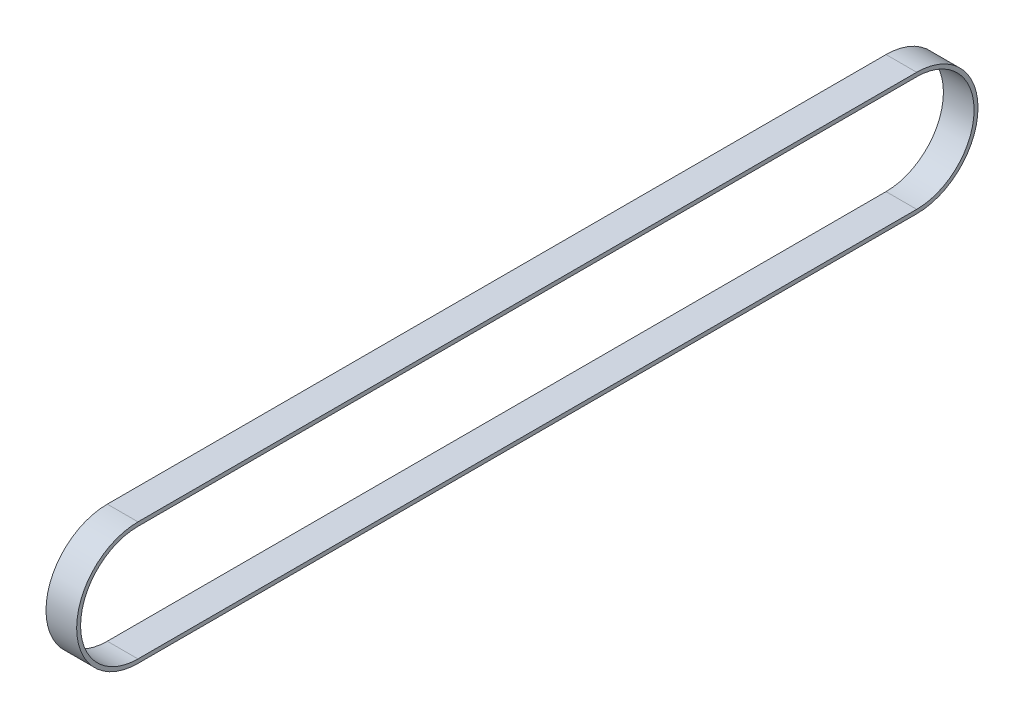
ISO-10303-21;
HEADER;
FILE_DESCRIPTION(('STEP AP214'),'2;1');
FILE_NAME('part.step','',(''),(''),'','','');
FILE_SCHEMA(('AUTOMOTIVE_DESIGN { 1 0 10303 214 1 1 1 1 }'));
ENDSEC;
DATA;
#1=APPLICATION_CONTEXT('core data for automotive mechanical design processes');
#2=APPLICATION_PROTOCOL_DEFINITION('international standard','automotive_design',2000,#1);
#3=PRODUCT_CONTEXT('',#1,'mechanical');
#4=PRODUCT('Part','Part','',(#3));
#5=PRODUCT_RELATED_PRODUCT_CATEGORY('part','',(#4));
#6=PRODUCT_DEFINITION_FORMATION('','',#4);
#7=PRODUCT_DEFINITION_CONTEXT('part definition',#1,'design');
#8=PRODUCT_DEFINITION('design','',#6,#7);
#9=PRODUCT_DEFINITION_SHAPE('','',#8);
#10=(LENGTH_UNIT() NAMED_UNIT(*) SI_UNIT(.MILLI.,.METRE.));
#11=(NAMED_UNIT(*) PLANE_ANGLE_UNIT() SI_UNIT($,.RADIAN.));
#12=(NAMED_UNIT(*) SI_UNIT($,.STERADIAN.) SOLID_ANGLE_UNIT());
#13=UNCERTAINTY_MEASURE_WITH_UNIT(LENGTH_MEASURE(1.E-05),#10,'distance_accuracy_value','');
#14=(GEOMETRIC_REPRESENTATION_CONTEXT(3) GLOBAL_UNCERTAINTY_ASSIGNED_CONTEXT((#13)) GLOBAL_UNIT_ASSIGNED_CONTEXT((#10,
#11,#12)) REPRESENTATION_CONTEXT('',''));
#15=CARTESIAN_POINT('',(0.,0.,0.));
#16=DIRECTION('',(0.,0.,1.));
#17=DIRECTION('',(1.,0.,0.));
#18=AXIS2_PLACEMENT_3D('',#15,#16,#17);
#19=CARTESIAN_POINT('',(15.,0.,0.));
#20=DIRECTION('',(1.,0.,0.));
#21=DIRECTION('',(0.,0.,-1.));
#22=AXIS2_PLACEMENT_3D('',#19,#20,#21);
#23=PLANE('',#22);
#24=CARTESIAN_POINT('',(15.,0.,0.));
#25=DIRECTION('',(1.,0.,0.));
#26=DIRECTION('',(0.,0.,-1.));
#27=AXIS2_PLACEMENT_3D('',#24,#25,#26);
#28=CIRCLE('',#27,29.999999944);
#29=CARTESIAN_POINT('',(15.,29.999999944,0.));
#30=VERTEX_POINT('',#29);
#31=CARTESIAN_POINT('',(15.,-29.999999944,0.));
#32=VERTEX_POINT('',#31);
#33=EDGE_CURVE('E153',#30,#32,#28,.T.);
#34=ORIENTED_EDGE('',*,*,#33,.T.);
#35=DIRECTION('',(0.,0.,-1.));
#36=VECTOR('',#35,1.);
#37=CARTESIAN_POINT('',(15.,-29.999999944,0.));
#38=LINE('',#37,#36);
#39=CARTESIAN_POINT('',(15.,-29.999999944,-381.));
#40=VERTEX_POINT('',#39);
#41=EDGE_CURVE('E157',#32,#40,#38,.T.);
#42=ORIENTED_EDGE('',*,*,#41,.T.);
#43=CARTESIAN_POINT('',(15.,0.,-381.));
#44=DIRECTION('',(1.,0.,0.));
#45=DIRECTION('',(0.,0.,-1.));
#46=AXIS2_PLACEMENT_3D('',#43,#44,#45);
#47=CIRCLE('',#46,29.999999944);
#48=CARTESIAN_POINT('',(15.,29.999999944,-381.));
#49=VERTEX_POINT('',#48);
#50=EDGE_CURVE('E161',#40,#49,#47,.T.);
#51=ORIENTED_EDGE('',*,*,#50,.T.);
#52=DIRECTION('',(0.,0.,1.));
#53=VECTOR('',#52,1.);
#54=CARTESIAN_POINT('',(15.,29.999999944,0.));
#55=LINE('',#54,#53);
#56=EDGE_CURVE('E164',#49,#30,#55,.T.);
#57=ORIENTED_EDGE('',*,*,#56,.T.);
#58=EDGE_LOOP('',(#34,#42,#51,#57));
#59=FACE_BOUND('',#58,.T.);
#60=DIRECTION('',(0.,0.,-1.));
#61=VECTOR('',#60,1.);
#62=CARTESIAN_POINT('',(15.,-28.079999974,0.));
#63=LINE('',#62,#61);
#64=CARTESIAN_POINT('',(15.,-28.079999974,0.));
#65=VERTEX_POINT('',#64);
#66=CARTESIAN_POINT('',(15.,-28.079999974,-381.));
#67=VERTEX_POINT('',#66);
#68=EDGE_CURVE('E114',#65,#67,#63,.T.);
#69=ORIENTED_EDGE('',*,*,#68,.F.);
#70=CARTESIAN_POINT('',(15.,0.,0.));
#71=DIRECTION('',(1.,0.,0.));
#72=DIRECTION('',(0.,0.,-1.));
#73=AXIS2_PLACEMENT_3D('',#70,#71,#72);
#74=CIRCLE('',#73,28.079999974);
#75=CARTESIAN_POINT('',(15.,28.079999974,0.));
#76=VERTEX_POINT('',#75);
#77=EDGE_CURVE('E105',#76,#65,#74,.T.);
#78=ORIENTED_EDGE('',*,*,#77,.F.);
#79=DIRECTION('',(0.,0.,1.));
#80=VECTOR('',#79,1.);
#81=CARTESIAN_POINT('',(15.,28.079999974,0.));
#82=LINE('',#81,#80);
#83=CARTESIAN_POINT('',(15.,28.079999974,-381.));
#84=VERTEX_POINT('',#83);
#85=EDGE_CURVE('E131',#84,#76,#82,.T.);
#86=ORIENTED_EDGE('',*,*,#85,.F.);
#87=CARTESIAN_POINT('',(15.,0.,-381.));
#88=DIRECTION('',(1.,0.,0.));
#89=DIRECTION('',(0.,0.,-1.));
#90=AXIS2_PLACEMENT_3D('',#87,#88,#89);
#91=CIRCLE('',#90,28.079999974);
#92=EDGE_CURVE('E127',#67,#84,#91,.T.);
#93=ORIENTED_EDGE('',*,*,#92,.F.);
#94=EDGE_LOOP('',(#69,#78,#86,#93));
#95=FACE_BOUND('',#94,.T.);
#96=ADVANCED_FACE('F39',(#59,#95),#23,.T.);
#97=CARTESIAN_POINT('',(0.,0.,0.));
#98=DIRECTION('',(1.,0.,0.));
#99=DIRECTION('',(0.,0.,-1.));
#100=AXIS2_PLACEMENT_3D('',#97,#98,#99);
#101=PLANE('',#100);
#102=CARTESIAN_POINT('',(0.,0.,0.));
#103=DIRECTION('',(1.,0.,0.));
#104=DIRECTION('',(0.,0.,-1.));
#105=AXIS2_PLACEMENT_3D('',#102,#103,#104);
#106=CIRCLE('',#105,29.999999944);
#107=CARTESIAN_POINT('',(0.,29.999999944,0.));
#108=VERTEX_POINT('',#107);
#109=CARTESIAN_POINT('',(0.,-29.999999944,0.));
#110=VERTEX_POINT('',#109);
#111=EDGE_CURVE('E123',#108,#110,#106,.T.);
#112=ORIENTED_EDGE('',*,*,#111,.F.);
#113=DIRECTION('',(0.,0.,1.));
#114=VECTOR('',#113,1.);
#115=CARTESIAN_POINT('',(0.,29.999999944,0.));
#116=LINE('',#115,#114);
#117=CARTESIAN_POINT('',(0.,29.999999944,-381.));
#118=VERTEX_POINT('',#117);
#119=EDGE_CURVE('E158',#118,#108,#116,.T.);
#120=ORIENTED_EDGE('',*,*,#119,.F.);
#121=CARTESIAN_POINT('',(0.,0.,-381.));
#122=DIRECTION('',(1.,0.,0.));
#123=DIRECTION('',(0.,0.,-1.));
#124=AXIS2_PLACEMENT_3D('',#121,#122,#123);
#125=CIRCLE('',#124,29.999999944);
#126=CARTESIAN_POINT('',(0.,-29.999999944,-381.));
#127=VERTEX_POINT('',#126);
#128=EDGE_CURVE('E174',#127,#118,#125,.T.);
#129=ORIENTED_EDGE('',*,*,#128,.F.);
#130=DIRECTION('',(0.,0.,-1.));
#131=VECTOR('',#130,1.);
#132=CARTESIAN_POINT('',(0.,-29.999999944,0.));
#133=LINE('',#132,#131);
#134=EDGE_CURVE('E171',#110,#127,#133,.T.);
#135=ORIENTED_EDGE('',*,*,#134,.F.);
#136=EDGE_LOOP('',(#112,#120,#129,#135));
#137=FACE_BOUND('',#136,.T.);
#138=CARTESIAN_POINT('',(0.,0.,0.));
#139=DIRECTION('',(1.,0.,0.));
#140=DIRECTION('',(0.,0.,-1.));
#141=AXIS2_PLACEMENT_3D('',#138,#139,#140);
#142=CIRCLE('',#141,28.079999974);
#143=CARTESIAN_POINT('',(0.,28.079999974,0.));
#144=VERTEX_POINT('',#143);
#145=CARTESIAN_POINT('',(0.,-28.079999974,0.));
#146=VERTEX_POINT('',#145);
#147=EDGE_CURVE('E63',#144,#146,#142,.T.);
#148=ORIENTED_EDGE('',*,*,#147,.T.);
#149=DIRECTION('',(0.,0.,-1.));
#150=VECTOR('',#149,1.);
#151=CARTESIAN_POINT('',(0.,-28.079999974,0.));
#152=LINE('',#151,#150);
#153=CARTESIAN_POINT('',(0.,-28.079999974,-381.));
#154=VERTEX_POINT('',#153);
#155=EDGE_CURVE('E121',#146,#154,#152,.T.);
#156=ORIENTED_EDGE('',*,*,#155,.T.);
#157=CARTESIAN_POINT('',(0.,0.,-381.));
#158=DIRECTION('',(1.,0.,0.));
#159=DIRECTION('',(0.,0.,-1.));
#160=AXIS2_PLACEMENT_3D('',#157,#158,#159);
#161=CIRCLE('',#160,28.079999974);
#162=CARTESIAN_POINT('',(0.,28.079999974,-381.));
#163=VERTEX_POINT('',#162);
#164=EDGE_CURVE('E140',#154,#163,#161,.T.);
#165=ORIENTED_EDGE('',*,*,#164,.T.);
#166=DIRECTION('',(0.,0.,1.));
#167=VECTOR('',#166,1.);
#168=CARTESIAN_POINT('',(0.,28.079999974,0.));
#169=LINE('',#168,#167);
#170=EDGE_CURVE('E115',#163,#144,#169,.T.);
#171=ORIENTED_EDGE('',*,*,#170,.T.);
#172=EDGE_LOOP('',(#148,#156,#165,#171));
#173=FACE_BOUND('',#172,.T.);
#174=ADVANCED_FACE('F197',(#137,#173),#101,.F.);
#175=CARTESIAN_POINT('',(15.,0.,0.));
#176=DIRECTION('',(-1.,0.,0.));
#177=DIRECTION('',(0.,0.,1.));
#178=AXIS2_PLACEMENT_3D('',#175,#176,#177);
#179=CYLINDRICAL_SURFACE('',#178,29.999999944);
#180=ORIENTED_EDGE('',*,*,#111,.T.);
#181=DIRECTION('',(-1.,0.,0.));
#182=VECTOR('',#181,1.);
#183=CARTESIAN_POINT('',(15.,-29.999999944,0.));
#184=LINE('',#183,#182);
#185=EDGE_CURVE('E11',#32,#110,#184,.T.);
#186=ORIENTED_EDGE('',*,*,#185,.F.);
#187=ORIENTED_EDGE('',*,*,#33,.F.);
#188=DIRECTION('',(-1.,0.,0.));
#189=VECTOR('',#188,1.);
#190=CARTESIAN_POINT('',(15.,29.999999944,0.));
#191=LINE('',#190,#189);
#192=EDGE_CURVE('E167',#30,#108,#191,.T.);
#193=ORIENTED_EDGE('',*,*,#192,.T.);
#194=EDGE_LOOP('',(#180,#186,#187,#193));
#195=FACE_BOUND('',#194,.T.);
#196=ADVANCED_FACE('F41',(#195),#179,.T.);
#197=CARTESIAN_POINT('',(15.,-29.999999944,0.));
#198=DIRECTION('',(0.,1.,0.));
#199=DIRECTION('',(0.,0.,1.));
#200=AXIS2_PLACEMENT_3D('',#197,#198,#199);
#201=PLANE('',#200);
#202=ORIENTED_EDGE('',*,*,#134,.T.);
#203=DIRECTION('',(-1.,0.,0.));
#204=VECTOR('',#203,1.);
#205=CARTESIAN_POINT('',(15.,-29.999999944,-381.));
#206=LINE('',#205,#204);
#207=EDGE_CURVE('E48',#40,#127,#206,.T.);
#208=ORIENTED_EDGE('',*,*,#207,.F.);
#209=ORIENTED_EDGE('',*,*,#41,.F.);
#210=ORIENTED_EDGE('',*,*,#185,.T.);
#211=EDGE_LOOP('',(#202,#208,#209,#210));
#212=FACE_BOUND('',#211,.T.);
#213=ADVANCED_FACE('F207',(#212),#201,.F.);
#214=CARTESIAN_POINT('',(15.,0.,-381.));
#215=DIRECTION('',(-1.,0.,0.));
#216=DIRECTION('',(0.,0.,1.));
#217=AXIS2_PLACEMENT_3D('',#214,#215,#216);
#218=CYLINDRICAL_SURFACE('',#217,29.999999944);
#219=ORIENTED_EDGE('',*,*,#128,.T.);
#220=DIRECTION('',(-1.,0.,0.));
#221=VECTOR('',#220,1.);
#222=CARTESIAN_POINT('',(15.,29.999999944,-381.));
#223=LINE('',#222,#221);
#224=EDGE_CURVE('E182',#49,#118,#223,.T.);
#225=ORIENTED_EDGE('',*,*,#224,.F.);
#226=ORIENTED_EDGE('',*,*,#50,.F.);
#227=ORIENTED_EDGE('',*,*,#207,.T.);
#228=EDGE_LOOP('',(#219,#225,#226,#227));
#229=FACE_BOUND('',#228,.T.);
#230=ADVANCED_FACE('F191',(#229),#218,.T.);
#231=CARTESIAN_POINT('',(15.,29.999999944,0.));
#232=DIRECTION('',(0.,-1.,0.));
#233=DIRECTION('',(0.,0.,-1.));
#234=AXIS2_PLACEMENT_3D('',#231,#232,#233);
#235=PLANE('',#234);
#236=ORIENTED_EDGE('',*,*,#119,.T.);
#237=ORIENTED_EDGE('',*,*,#192,.F.);
#238=ORIENTED_EDGE('',*,*,#56,.F.);
#239=ORIENTED_EDGE('',*,*,#224,.T.);
#240=EDGE_LOOP('',(#236,#237,#238,#239));
#241=FACE_BOUND('',#240,.T.);
#242=ADVANCED_FACE('F201',(#241),#235,.F.);
#243=CARTESIAN_POINT('',(15.,0.,0.));
#244=DIRECTION('',(-1.,0.,0.));
#245=DIRECTION('',(0.,0.,1.));
#246=AXIS2_PLACEMENT_3D('',#243,#244,#245);
#247=CYLINDRICAL_SURFACE('',#246,28.079999974);
#248=ORIENTED_EDGE('',*,*,#147,.F.);
#249=DIRECTION('',(-1.,0.,0.));
#250=VECTOR('',#249,1.);
#251=CARTESIAN_POINT('',(15.,28.079999974,0.));
#252=LINE('',#251,#250);
#253=EDGE_CURVE('E109',#76,#144,#252,.T.);
#254=ORIENTED_EDGE('',*,*,#253,.F.);
#255=ORIENTED_EDGE('',*,*,#77,.T.);
#256=DIRECTION('',(-1.,0.,0.));
#257=VECTOR('',#256,1.);
#258=CARTESIAN_POINT('',(15.,-28.079999974,0.));
#259=LINE('',#258,#257);
#260=EDGE_CURVE('E108',#65,#146,#259,.T.);
#261=ORIENTED_EDGE('',*,*,#260,.T.);
#262=EDGE_LOOP('',(#248,#254,#255,#261));
#263=FACE_BOUND('',#262,.T.);
#264=ADVANCED_FACE('F107',(#263),#247,.F.);
#265=CARTESIAN_POINT('',(15.,-28.079999974,0.));
#266=DIRECTION('',(0.,1.,0.));
#267=DIRECTION('',(0.,0.,1.));
#268=AXIS2_PLACEMENT_3D('',#265,#266,#267);
#269=PLANE('',#268);
#270=ORIENTED_EDGE('',*,*,#155,.F.);
#271=ORIENTED_EDGE('',*,*,#260,.F.);
#272=ORIENTED_EDGE('',*,*,#68,.T.);
#273=DIRECTION('',(-1.,0.,0.));
#274=VECTOR('',#273,1.);
#275=CARTESIAN_POINT('',(15.,-28.079999974,-381.));
#276=LINE('',#275,#274);
#277=EDGE_CURVE('E124',#67,#154,#276,.T.);
#278=ORIENTED_EDGE('',*,*,#277,.T.);
#279=EDGE_LOOP('',(#270,#271,#272,#278));
#280=FACE_BOUND('',#279,.T.);
#281=ADVANCED_FACE('F118',(#280),#269,.T.);
#282=CARTESIAN_POINT('',(15.,0.,-381.));
#283=DIRECTION('',(-1.,0.,0.));
#284=DIRECTION('',(0.,0.,1.));
#285=AXIS2_PLACEMENT_3D('',#282,#283,#284);
#286=CYLINDRICAL_SURFACE('',#285,28.079999974);
#287=ORIENTED_EDGE('',*,*,#164,.F.);
#288=ORIENTED_EDGE('',*,*,#277,.F.);
#289=ORIENTED_EDGE('',*,*,#92,.T.);
#290=DIRECTION('',(-1.,0.,0.));
#291=VECTOR('',#290,1.);
#292=CARTESIAN_POINT('',(15.,28.079999974,-381.));
#293=LINE('',#292,#291);
#294=EDGE_CURVE('E55',#84,#163,#293,.T.);
#295=ORIENTED_EDGE('',*,*,#294,.T.);
#296=EDGE_LOOP('',(#287,#288,#289,#295));
#297=FACE_BOUND('',#296,.T.);
#298=ADVANCED_FACE('F230',(#297),#286,.F.);
#299=CARTESIAN_POINT('',(15.,28.079999974,0.));
#300=DIRECTION('',(0.,-1.,0.));
#301=DIRECTION('',(0.,0.,-1.));
#302=AXIS2_PLACEMENT_3D('',#299,#300,#301);
#303=PLANE('',#302);
#304=ORIENTED_EDGE('',*,*,#170,.F.);
#305=ORIENTED_EDGE('',*,*,#294,.F.);
#306=ORIENTED_EDGE('',*,*,#85,.T.);
#307=ORIENTED_EDGE('',*,*,#253,.T.);
#308=EDGE_LOOP('',(#304,#305,#306,#307));
#309=FACE_BOUND('',#308,.T.);
#310=ADVANCED_FACE('F234',(#309),#303,.T.);
#311=CLOSED_SHELL('',(#96,#174,#196,#213,#230,#242,#264,#281,#298,#310));
#312=MANIFOLD_SOLID_BREP('B2',#311);
#313=ADVANCED_BREP_SHAPE_REPRESENTATION('',(#18,#312),#14);
#314=SHAPE_DEFINITION_REPRESENTATION(#9,#313);
ENDSEC;
END-ISO-10303-21;
